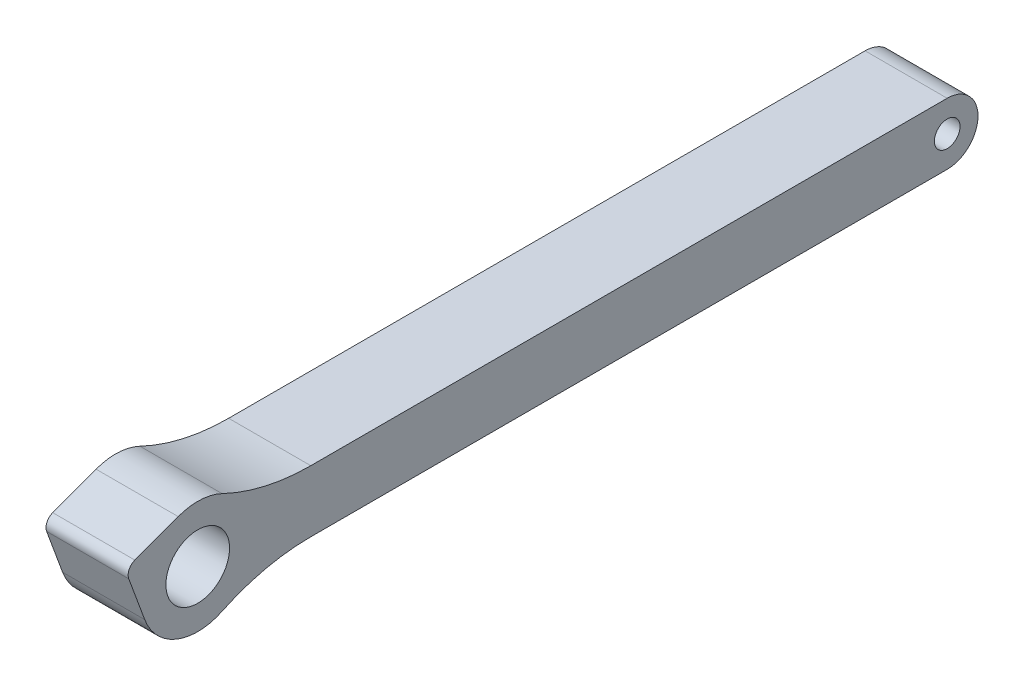
ISO-10303-21;
HEADER;
FILE_DESCRIPTION(('STEP AP214'),'2;1');
FILE_NAME('part.step','',(''),(''),'','','');
FILE_SCHEMA(('AUTOMOTIVE_DESIGN { 1 0 10303 214 1 1 1 1 }'));
ENDSEC;
DATA;
#1=APPLICATION_CONTEXT('core data for automotive mechanical design processes');
#2=APPLICATION_PROTOCOL_DEFINITION('international standard','automotive_design',2000,#1);
#3=PRODUCT_CONTEXT('',#1,'mechanical');
#4=PRODUCT('Part','Part','',(#3));
#5=PRODUCT_RELATED_PRODUCT_CATEGORY('part','',(#4));
#6=PRODUCT_DEFINITION_FORMATION('','',#4);
#7=PRODUCT_DEFINITION_CONTEXT('part definition',#1,'design');
#8=PRODUCT_DEFINITION('design','',#6,#7);
#9=PRODUCT_DEFINITION_SHAPE('','',#8);
#10=(LENGTH_UNIT() NAMED_UNIT(*) SI_UNIT(.MILLI.,.METRE.));
#11=(NAMED_UNIT(*) PLANE_ANGLE_UNIT() SI_UNIT($,.RADIAN.));
#12=(NAMED_UNIT(*) SI_UNIT($,.STERADIAN.) SOLID_ANGLE_UNIT());
#13=UNCERTAINTY_MEASURE_WITH_UNIT(LENGTH_MEASURE(1.E-05),#10,'distance_accuracy_value','');
#14=(GEOMETRIC_REPRESENTATION_CONTEXT(3) GLOBAL_UNCERTAINTY_ASSIGNED_CONTEXT((#13)) GLOBAL_UNIT_ASSIGNED_CONTEXT((#10,
#11,#12)) REPRESENTATION_CONTEXT('',''));
#15=CARTESIAN_POINT('',(0.,0.,0.));
#16=DIRECTION('',(0.,0.,1.));
#17=DIRECTION('',(1.,0.,0.));
#18=AXIS2_PLACEMENT_3D('',#15,#16,#17);
#19=CARTESIAN_POINT('',(4.,0.,0.));
#20=DIRECTION('',(1.,0.,0.));
#21=DIRECTION('',(0.,0.,-1.));
#22=AXIS2_PLACEMENT_3D('',#19,#20,#21);
#23=PLANE('',#22);
#24=CARTESIAN_POINT('',(4.,0.,0.));
#25=DIRECTION('',(1.,0.,0.));
#26=DIRECTION('',(0.,0.,-1.));
#27=AXIS2_PLACEMENT_3D('',#24,#25,#26);
#28=CIRCLE('',#27,1.25);
#29=CARTESIAN_POINT('',(4.,0.,-1.25));
#30=VERTEX_POINT('',#29);
#31=EDGE_CURVE('E162',#30,#30,#28,.T.);
#32=ORIENTED_EDGE('',*,*,#31,.F.);
#33=EDGE_LOOP('',(#32));
#34=FACE_BOUND('',#33,.T.);
#35=CARTESIAN_POINT('',(4.,0.,0.));
#36=DIRECTION('',(1.,0.,0.));
#37=DIRECTION('',(0.,0.,-1.));
#38=AXIS2_PLACEMENT_3D('',#35,#36,#37);
#39=CIRCLE('',#38,3.);
#40=CARTESIAN_POINT('',(4.,-3.,0.));
#41=VERTEX_POINT('',#40);
#42=CARTESIAN_POINT('',(4.,3.,0.));
#43=VERTEX_POINT('',#42);
#44=EDGE_CURVE('E186',#41,#43,#39,.T.);
#45=ORIENTED_EDGE('',*,*,#44,.T.);
#46=DIRECTION('',(0.,0.,1.));
#47=VECTOR('',#46,1.);
#48=CARTESIAN_POINT('',(4.,3.,61.9886422272274));
#49=LINE('',#48,#47);
#50=CARTESIAN_POINT('',(4.,3.,61.9886422272274));
#51=VERTEX_POINT('',#50);
#52=EDGE_CURVE('E110',#43,#51,#49,.T.);
#53=ORIENTED_EDGE('',*,*,#52,.T.);
#54=CARTESIAN_POINT('',(4.,23.,61.9886422272274));
#55=DIRECTION('',(-1.,0.,0.));
#56=DIRECTION('',(0.,0.,-1.));
#57=AXIS2_PLACEMENT_3D('',#54,#55,#56);
#58=CIRCLE('',#57,20.);
#59=CARTESIAN_POINT('',(4.,4.96078431372549,70.6250012646961));
#60=VERTEX_POINT('',#59);
#61=EDGE_CURVE('E215',#51,#60,#58,.T.);
#62=ORIENTED_EDGE('',*,*,#61,.T.);
#63=CARTESIAN_POINT('',(4.,0.,73.));
#64=DIRECTION('',(1.,0.,0.));
#65=DIRECTION('',(0.,0.,-1.));
#66=AXIS2_PLACEMENT_3D('',#63,#64,#65);
#67=CIRCLE('',#66,5.5);
#68=CARTESIAN_POINT('',(4.,5.16111841818336,74.9007516075196));
#69=VERTEX_POINT('',#68);
#70=EDGE_CURVE('E235',#60,#69,#67,.T.);
#71=ORIENTED_EDGE('',*,*,#70,.T.);
#72=DIRECTION('',(0.,-0.345591201367204,0.93838516694243));
#73=VECTOR('',#72,1.);
#74=CARTESIAN_POINT('',(4.,5.16111841818336,74.9007516075196));
#75=LINE('',#74,#73);
#76=CARTESIAN_POINT('',(4.,3.60595801203095,79.1234848587605));
#77=VERTEX_POINT('',#76);
#78=EDGE_CURVE('E231',#69,#77,#75,.T.);
#79=ORIENTED_EDGE('',*,*,#78,.T.);
#80=CARTESIAN_POINT('',(4.,2.66757284508852,78.7778936573933));
#81=DIRECTION('',(1.,0.,0.));
#82=DIRECTION('',(0.,0.,1.));
#83=AXIS2_PLACEMENT_3D('',#80,#81,#82);
#84=CIRCLE('',#83,1.);
#85=CARTESIAN_POINT('',(4.,2.32198164372133,79.7162788243357));
#86=VERTEX_POINT('',#85);
#87=EDGE_CURVE('E234',#77,#86,#84,.T.);
#88=ORIENTED_EDGE('',*,*,#87,.T.);
#89=DIRECTION('',(0.,-0.938385166942434,-0.345591201367195));
#90=VECTOR('',#89,1.);
#91=CARTESIAN_POINT('',(4.,-1.90075160751958,78.1611184181834));
#92=LINE('',#91,#90);
#93=CARTESIAN_POINT('',(4.,-1.90075160751958,78.1611184181834));
#94=VERTEX_POINT('',#93);
#95=EDGE_CURVE('E135',#86,#94,#92,.T.);
#96=ORIENTED_EDGE('',*,*,#95,.T.);
#97=CARTESIAN_POINT('',(4.,0.,73.));
#98=DIRECTION('',(1.,0.,0.));
#99=DIRECTION('',(0.,0.,-1.));
#100=AXIS2_PLACEMENT_3D('',#97,#98,#99);
#101=CIRCLE('',#100,5.5);
#102=CARTESIAN_POINT('',(4.,-4.9607843137255,70.6250012646961));
#103=VERTEX_POINT('',#102);
#104=EDGE_CURVE('E129',#94,#103,#101,.T.);
#105=ORIENTED_EDGE('',*,*,#104,.T.);
#106=CARTESIAN_POINT('',(4.,-23.,61.9886422272274));
#107=DIRECTION('',(-1.,0.,0.));
#108=DIRECTION('',(0.,0.,1.));
#109=AXIS2_PLACEMENT_3D('',#106,#107,#108);
#110=CIRCLE('',#109,20.);
#111=CARTESIAN_POINT('',(4.,-3.,61.9886422272274));
#112=VERTEX_POINT('',#111);
#113=EDGE_CURVE('E133',#103,#112,#110,.T.);
#114=ORIENTED_EDGE('',*,*,#113,.T.);
#115=DIRECTION('',(0.,0.,-1.));
#116=VECTOR('',#115,1.);
#117=CARTESIAN_POINT('',(4.,-3.,61.9886422272274));
#118=LINE('',#117,#116);
#119=EDGE_CURVE('E61',#112,#41,#118,.T.);
#120=ORIENTED_EDGE('',*,*,#119,.T.);
#121=EDGE_LOOP('',(#45,#53,#62,#71,#79,#88,#96,#105,#114,#120));
#122=FACE_BOUND('',#121,.T.);
#123=CARTESIAN_POINT('',(4.,0.,73.));
#124=DIRECTION('',(1.,0.,0.));
#125=DIRECTION('',(0.,0.,-1.));
#126=AXIS2_PLACEMENT_3D('',#123,#124,#125);
#127=CIRCLE('',#126,3.1);
#128=CARTESIAN_POINT('',(4.,0.,69.9));
#129=VERTEX_POINT('',#128);
#130=EDGE_CURVE('E253',#129,#129,#127,.T.);
#131=ORIENTED_EDGE('',*,*,#130,.F.);
#132=EDGE_LOOP('',(#131));
#133=FACE_BOUND('',#132,.T.);
#134=ADVANCED_FACE('F43',(#34,#122,#133),#23,.T.);
#135=CARTESIAN_POINT('',(-4.,0.,0.));
#136=DIRECTION('',(1.,0.,0.));
#137=DIRECTION('',(0.,0.,-1.));
#138=AXIS2_PLACEMENT_3D('',#135,#136,#137);
#139=PLANE('',#138);
#140=CARTESIAN_POINT('',(-4.,0.,0.));
#141=DIRECTION('',(1.,0.,0.));
#142=DIRECTION('',(0.,0.,-1.));
#143=AXIS2_PLACEMENT_3D('',#140,#141,#142);
#144=CIRCLE('',#143,3.);
#145=CARTESIAN_POINT('',(-4.,-3.,0.));
#146=VERTEX_POINT('',#145);
#147=CARTESIAN_POINT('',(-4.,3.,0.));
#148=VERTEX_POINT('',#147);
#149=EDGE_CURVE('E157',#146,#148,#144,.T.);
#150=ORIENTED_EDGE('',*,*,#149,.F.);
#151=DIRECTION('',(0.,0.,-1.));
#152=VECTOR('',#151,1.);
#153=CARTESIAN_POINT('',(-4.,-3.,61.9886422272274));
#154=LINE('',#153,#152);
#155=CARTESIAN_POINT('',(-4.,-3.,61.9886422272274));
#156=VERTEX_POINT('',#155);
#157=EDGE_CURVE('E102',#156,#146,#154,.T.);
#158=ORIENTED_EDGE('',*,*,#157,.F.);
#159=CARTESIAN_POINT('',(-4.,-23.,61.9886422272274));
#160=DIRECTION('',(-1.,0.,0.));
#161=DIRECTION('',(0.,0.,1.));
#162=AXIS2_PLACEMENT_3D('',#159,#160,#161);
#163=CIRCLE('',#162,20.);
#164=CARTESIAN_POINT('',(-4.,-4.9607843137255,70.6250012646961));
#165=VERTEX_POINT('',#164);
#166=EDGE_CURVE('E96',#165,#156,#163,.T.);
#167=ORIENTED_EDGE('',*,*,#166,.F.);
#168=CARTESIAN_POINT('',(-4.,0.,73.));
#169=DIRECTION('',(1.,0.,0.));
#170=DIRECTION('',(0.,0.,-1.));
#171=AXIS2_PLACEMENT_3D('',#168,#169,#170);
#172=CIRCLE('',#171,5.5);
#173=CARTESIAN_POINT('',(-4.,-1.90075160751958,78.1611184181834));
#174=VERTEX_POINT('',#173);
#175=EDGE_CURVE('E144',#174,#165,#172,.T.);
#176=ORIENTED_EDGE('',*,*,#175,.F.);
#177=DIRECTION('',(0.,-0.938385166942434,-0.345591201367195));
#178=VECTOR('',#177,1.);
#179=CARTESIAN_POINT('',(-4.,-1.90075160751958,78.1611184181834));
#180=LINE('',#179,#178);
#181=CARTESIAN_POINT('',(-4.,2.32198164372133,79.7162788243357));
#182=VERTEX_POINT('',#181);
#183=EDGE_CURVE('E177',#182,#174,#180,.T.);
#184=ORIENTED_EDGE('',*,*,#183,.F.);
#185=CARTESIAN_POINT('',(-4.,2.66757284508852,78.7778936573933));
#186=DIRECTION('',(1.,0.,0.));
#187=DIRECTION('',(0.,0.,1.));
#188=AXIS2_PLACEMENT_3D('',#185,#186,#187);
#189=CIRCLE('',#188,1.);
#190=CARTESIAN_POINT('',(-4.,3.60595801203095,79.1234848587605));
#191=VERTEX_POINT('',#190);
#192=EDGE_CURVE('E174',#191,#182,#189,.T.);
#193=ORIENTED_EDGE('',*,*,#192,.F.);
#194=DIRECTION('',(0.,-0.345591201367204,0.93838516694243));
#195=VECTOR('',#194,1.);
#196=CARTESIAN_POINT('',(-4.,5.16111841818336,74.9007516075196));
#197=LINE('',#196,#195);
#198=CARTESIAN_POINT('',(-4.,5.16111841818336,74.9007516075196));
#199=VERTEX_POINT('',#198);
#200=EDGE_CURVE('E171',#199,#191,#197,.T.);
#201=ORIENTED_EDGE('',*,*,#200,.F.);
#202=CARTESIAN_POINT('',(-4.,0.,73.));
#203=DIRECTION('',(1.,0.,0.));
#204=DIRECTION('',(0.,0.,-1.));
#205=AXIS2_PLACEMENT_3D('',#202,#203,#204);
#206=CIRCLE('',#205,5.5);
#207=CARTESIAN_POINT('',(-4.,4.96078431372549,70.6250012646961));
#208=VERTEX_POINT('',#207);
#209=EDGE_CURVE('E168',#208,#199,#206,.T.);
#210=ORIENTED_EDGE('',*,*,#209,.F.);
#211=CARTESIAN_POINT('',(-4.,23.,61.9886422272274));
#212=DIRECTION('',(-1.,0.,0.));
#213=DIRECTION('',(0.,0.,-1.));
#214=AXIS2_PLACEMENT_3D('',#211,#212,#213);
#215=CIRCLE('',#214,20.);
#216=CARTESIAN_POINT('',(-4.,3.,61.9886422272274));
#217=VERTEX_POINT('',#216);
#218=EDGE_CURVE('E165',#217,#208,#215,.T.);
#219=ORIENTED_EDGE('',*,*,#218,.F.);
#220=DIRECTION('',(0.,0.,1.));
#221=VECTOR('',#220,1.);
#222=CARTESIAN_POINT('',(-4.,3.,61.9886422272274));
#223=LINE('',#222,#221);
#224=EDGE_CURVE('E161',#148,#217,#223,.T.);
#225=ORIENTED_EDGE('',*,*,#224,.F.);
#226=EDGE_LOOP('',(#150,#158,#167,#176,#184,#193,#201,#210,#219,#225));
#227=FACE_BOUND('',#226,.T.);
#228=CARTESIAN_POINT('',(-4.,0.,0.));
#229=DIRECTION('',(1.,0.,0.));
#230=DIRECTION('',(0.,0.,-1.));
#231=AXIS2_PLACEMENT_3D('',#228,#229,#230);
#232=CIRCLE('',#231,1.25);
#233=CARTESIAN_POINT('',(-4.,0.,-1.25));
#234=VERTEX_POINT('',#233);
#235=EDGE_CURVE('E249',#234,#234,#232,.T.);
#236=ORIENTED_EDGE('',*,*,#235,.T.);
#237=EDGE_LOOP('',(#236));
#238=FACE_BOUND('',#237,.T.);
#239=CARTESIAN_POINT('',(-4.,0.,73.));
#240=DIRECTION('',(1.,0.,0.));
#241=DIRECTION('',(0.,0.,-1.));
#242=AXIS2_PLACEMENT_3D('',#239,#240,#241);
#243=CIRCLE('',#242,3.1);
#244=CARTESIAN_POINT('',(-4.,0.,69.9));
#245=VERTEX_POINT('',#244);
#246=EDGE_CURVE('E257',#245,#245,#243,.T.);
#247=ORIENTED_EDGE('',*,*,#246,.T.);
#248=EDGE_LOOP('',(#247));
#249=FACE_BOUND('',#248,.T.);
#250=ADVANCED_FACE('F219',(#227,#238,#249),#139,.F.);
#251=CARTESIAN_POINT('',(4.,0.,0.));
#252=DIRECTION('',(-1.,0.,0.));
#253=DIRECTION('',(0.,0.,1.));
#254=AXIS2_PLACEMENT_3D('',#251,#252,#253);
#255=CYLINDRICAL_SURFACE('',#254,3.);
#256=ORIENTED_EDGE('',*,*,#149,.T.);
#257=DIRECTION('',(-1.,0.,0.));
#258=VECTOR('',#257,1.);
#259=CARTESIAN_POINT('',(4.,3.,0.));
#260=LINE('',#259,#258);
#261=EDGE_CURVE('E11',#43,#148,#260,.T.);
#262=ORIENTED_EDGE('',*,*,#261,.F.);
#263=ORIENTED_EDGE('',*,*,#44,.F.);
#264=DIRECTION('',(-1.,0.,0.));
#265=VECTOR('',#264,1.);
#266=CARTESIAN_POINT('',(4.,-3.,0.));
#267=LINE('',#266,#265);
#268=EDGE_CURVE('E153',#41,#146,#267,.T.);
#269=ORIENTED_EDGE('',*,*,#268,.T.);
#270=EDGE_LOOP('',(#256,#262,#263,#269));
#271=FACE_BOUND('',#270,.T.);
#272=ADVANCED_FACE('F45',(#271),#255,.T.);
#273=CARTESIAN_POINT('',(4.,3.,61.9886422272274));
#274=DIRECTION('',(0.,-1.,0.));
#275=DIRECTION('',(0.,0.,-1.));
#276=AXIS2_PLACEMENT_3D('',#273,#274,#275);
#277=PLANE('',#276);
#278=ORIENTED_EDGE('',*,*,#224,.T.);
#279=DIRECTION('',(-1.,0.,0.));
#280=VECTOR('',#279,1.);
#281=CARTESIAN_POINT('',(4.,3.,61.9886422272274));
#282=LINE('',#281,#280);
#283=EDGE_CURVE('E53',#51,#217,#282,.T.);
#284=ORIENTED_EDGE('',*,*,#283,.F.);
#285=ORIENTED_EDGE('',*,*,#52,.F.);
#286=ORIENTED_EDGE('',*,*,#261,.T.);
#287=EDGE_LOOP('',(#278,#284,#285,#286));
#288=FACE_BOUND('',#287,.T.);
#289=ADVANCED_FACE('F299',(#288),#277,.F.);
#290=CARTESIAN_POINT('',(4.,23.,61.9886422272274));
#291=DIRECTION('',(-1.,0.,0.));
#292=DIRECTION('',(0.,0.,1.));
#293=AXIS2_PLACEMENT_3D('',#290,#291,#292);
#294=CYLINDRICAL_SURFACE('',#293,20.);
#295=ORIENTED_EDGE('',*,*,#218,.T.);
#296=DIRECTION('',(-1.,0.,0.));
#297=VECTOR('',#296,1.);
#298=CARTESIAN_POINT('',(4.,4.96078431372549,70.6250012646961));
#299=LINE('',#298,#297);
#300=EDGE_CURVE('E205',#60,#208,#299,.T.);
#301=ORIENTED_EDGE('',*,*,#300,.F.);
#302=ORIENTED_EDGE('',*,*,#61,.F.);
#303=ORIENTED_EDGE('',*,*,#283,.T.);
#304=EDGE_LOOP('',(#295,#301,#302,#303));
#305=FACE_BOUND('',#304,.T.);
#306=ADVANCED_FACE('F213',(#305),#294,.F.);
#307=CARTESIAN_POINT('',(4.,0.,73.));
#308=DIRECTION('',(-1.,0.,0.));
#309=DIRECTION('',(0.,0.,1.));
#310=AXIS2_PLACEMENT_3D('',#307,#308,#309);
#311=CYLINDRICAL_SURFACE('',#310,5.5);
#312=ORIENTED_EDGE('',*,*,#209,.T.);
#313=DIRECTION('',(-1.,0.,0.));
#314=VECTOR('',#313,1.);
#315=CARTESIAN_POINT('',(4.,5.16111841818336,74.9007516075196));
#316=LINE('',#315,#314);
#317=EDGE_CURVE('E201',#69,#199,#316,.T.);
#318=ORIENTED_EDGE('',*,*,#317,.F.);
#319=ORIENTED_EDGE('',*,*,#70,.F.);
#320=ORIENTED_EDGE('',*,*,#300,.T.);
#321=EDGE_LOOP('',(#312,#318,#319,#320));
#322=FACE_BOUND('',#321,.T.);
#323=ADVANCED_FACE('F225',(#322),#311,.T.);
#324=CARTESIAN_POINT('',(4.,5.16111841818336,74.9007516075196));
#325=DIRECTION('',(0.,-0.93838516694243,-0.345591201367204));
#326=DIRECTION('',(0.,0.345591201367204,-0.93838516694243));
#327=AXIS2_PLACEMENT_3D('',#324,#325,#326);
#328=PLANE('',#327);
#329=ORIENTED_EDGE('',*,*,#200,.T.);
#330=DIRECTION('',(-1.,0.,0.));
#331=VECTOR('',#330,1.);
#332=CARTESIAN_POINT('',(4.,3.60595801203095,79.1234848587605));
#333=LINE('',#332,#331);
#334=EDGE_CURVE('E197',#77,#191,#333,.T.);
#335=ORIENTED_EDGE('',*,*,#334,.F.);
#336=ORIENTED_EDGE('',*,*,#78,.F.);
#337=ORIENTED_EDGE('',*,*,#317,.T.);
#338=EDGE_LOOP('',(#329,#335,#336,#337));
#339=FACE_BOUND('',#338,.T.);
#340=ADVANCED_FACE('F229',(#339),#328,.F.);
#341=CARTESIAN_POINT('',(4.,2.66757284508852,78.7778936573933));
#342=DIRECTION('',(-1.,0.,0.));
#343=DIRECTION('',(0.,0.,1.));
#344=AXIS2_PLACEMENT_3D('',#341,#342,#343);
#345=CYLINDRICAL_SURFACE('',#344,1.);
#346=ORIENTED_EDGE('',*,*,#192,.T.);
#347=DIRECTION('',(-1.,0.,0.));
#348=VECTOR('',#347,1.);
#349=CARTESIAN_POINT('',(4.,2.32198164372133,79.7162788243357));
#350=LINE('',#349,#348);
#351=EDGE_CURVE('E193',#86,#182,#350,.T.);
#352=ORIENTED_EDGE('',*,*,#351,.F.);
#353=ORIENTED_EDGE('',*,*,#87,.F.);
#354=ORIENTED_EDGE('',*,*,#334,.T.);
#355=EDGE_LOOP('',(#346,#352,#353,#354));
#356=FACE_BOUND('',#355,.T.);
#357=ADVANCED_FACE('F289',(#356),#345,.T.);
#358=CARTESIAN_POINT('',(4.,-1.90075160751958,78.1611184181834));
#359=DIRECTION('',(0.,0.345591201367195,-0.938385166942434));
#360=DIRECTION('',(0.,0.938385166942434,0.345591201367195));
#361=AXIS2_PLACEMENT_3D('',#358,#359,#360);
#362=PLANE('',#361);
#363=ORIENTED_EDGE('',*,*,#183,.T.);
#364=DIRECTION('',(-1.,0.,0.));
#365=VECTOR('',#364,1.);
#366=CARTESIAN_POINT('',(4.,-1.90075160751958,78.1611184181834));
#367=LINE('',#366,#365);
#368=EDGE_CURVE('E146',#94,#174,#367,.T.);
#369=ORIENTED_EDGE('',*,*,#368,.F.);
#370=ORIENTED_EDGE('',*,*,#95,.F.);
#371=ORIENTED_EDGE('',*,*,#351,.T.);
#372=EDGE_LOOP('',(#363,#369,#370,#371));
#373=FACE_BOUND('',#372,.T.);
#374=ADVANCED_FACE('F286',(#373),#362,.F.);
#375=CARTESIAN_POINT('',(4.,0.,73.));
#376=DIRECTION('',(-1.,0.,0.));
#377=DIRECTION('',(0.,0.,1.));
#378=AXIS2_PLACEMENT_3D('',#375,#376,#377);
#379=CYLINDRICAL_SURFACE('',#378,5.5);
#380=ORIENTED_EDGE('',*,*,#175,.T.);
#381=DIRECTION('',(-1.,0.,0.));
#382=VECTOR('',#381,1.);
#383=CARTESIAN_POINT('',(4.,-4.9607843137255,70.6250012646961));
#384=LINE('',#383,#382);
#385=EDGE_CURVE('E141',#103,#165,#384,.T.);
#386=ORIENTED_EDGE('',*,*,#385,.F.);
#387=ORIENTED_EDGE('',*,*,#104,.F.);
#388=ORIENTED_EDGE('',*,*,#368,.T.);
#389=EDGE_LOOP('',(#380,#386,#387,#388));
#390=FACE_BOUND('',#389,.T.);
#391=ADVANCED_FACE('F142',(#390),#379,.T.);
#392=CARTESIAN_POINT('',(4.,-23.,61.9886422272274));
#393=DIRECTION('',(-1.,0.,0.));
#394=DIRECTION('',(0.,0.,1.));
#395=AXIS2_PLACEMENT_3D('',#392,#393,#394);
#396=CYLINDRICAL_SURFACE('',#395,20.);
#397=ORIENTED_EDGE('',*,*,#166,.T.);
#398=DIRECTION('',(-1.,0.,0.));
#399=VECTOR('',#398,1.);
#400=CARTESIAN_POINT('',(4.,-3.,61.9886422272274));
#401=LINE('',#400,#399);
#402=EDGE_CURVE('E147',#112,#156,#401,.T.);
#403=ORIENTED_EDGE('',*,*,#402,.F.);
#404=ORIENTED_EDGE('',*,*,#113,.F.);
#405=ORIENTED_EDGE('',*,*,#385,.T.);
#406=EDGE_LOOP('',(#397,#403,#404,#405));
#407=FACE_BOUND('',#406,.T.);
#408=ADVANCED_FACE('F149',(#407),#396,.F.);
#409=CARTESIAN_POINT('',(4.,-3.,61.9886422272274));
#410=DIRECTION('',(0.,1.,0.));
#411=DIRECTION('',(0.,0.,1.));
#412=AXIS2_PLACEMENT_3D('',#409,#410,#411);
#413=PLANE('',#412);
#414=ORIENTED_EDGE('',*,*,#157,.T.);
#415=ORIENTED_EDGE('',*,*,#268,.F.);
#416=ORIENTED_EDGE('',*,*,#119,.F.);
#417=ORIENTED_EDGE('',*,*,#402,.T.);
#418=EDGE_LOOP('',(#414,#415,#416,#417));
#419=FACE_BOUND('',#418,.T.);
#420=ADVANCED_FACE('F279',(#419),#413,.F.);
#421=CARTESIAN_POINT('',(4.,0.,0.));
#422=DIRECTION('',(-1.,0.,0.));
#423=DIRECTION('',(0.,0.,1.));
#424=AXIS2_PLACEMENT_3D('',#421,#422,#423);
#425=CYLINDRICAL_SURFACE('',#424,1.25);
#426=ORIENTED_EDGE('',*,*,#31,.T.);
#427=EDGE_LOOP('',(#426));
#428=FACE_BOUND('',#427,.T.);
#429=ORIENTED_EDGE('',*,*,#235,.F.);
#430=EDGE_LOOP('',(#429));
#431=FACE_BOUND('',#430,.T.);
#432=ADVANCED_FACE('F276',(#428,#431),#425,.F.);
#433=CARTESIAN_POINT('',(4.,0.,73.));
#434=DIRECTION('',(-1.,0.,0.));
#435=DIRECTION('',(0.,0.,1.));
#436=AXIS2_PLACEMENT_3D('',#433,#434,#435);
#437=CYLINDRICAL_SURFACE('',#436,3.1);
#438=ORIENTED_EDGE('',*,*,#130,.T.);
#439=EDGE_LOOP('',(#438));
#440=FACE_BOUND('',#439,.T.);
#441=ORIENTED_EDGE('',*,*,#246,.F.);
#442=EDGE_LOOP('',(#441));
#443=FACE_BOUND('',#442,.T.);
#444=ADVANCED_FACE('F265',(#440,#443),#437,.F.);
#445=CLOSED_SHELL('',(#134,#250,#272,#289,#306,#323,#340,#357,#374,#391,#408,#420,#432,#444));
#446=MANIFOLD_SOLID_BREP('B2',#445);
#447=ADVANCED_BREP_SHAPE_REPRESENTATION('',(#18,#446),#14);
#448=SHAPE_DEFINITION_REPRESENTATION(#9,#447);
ENDSEC;
END-ISO-10303-21;
